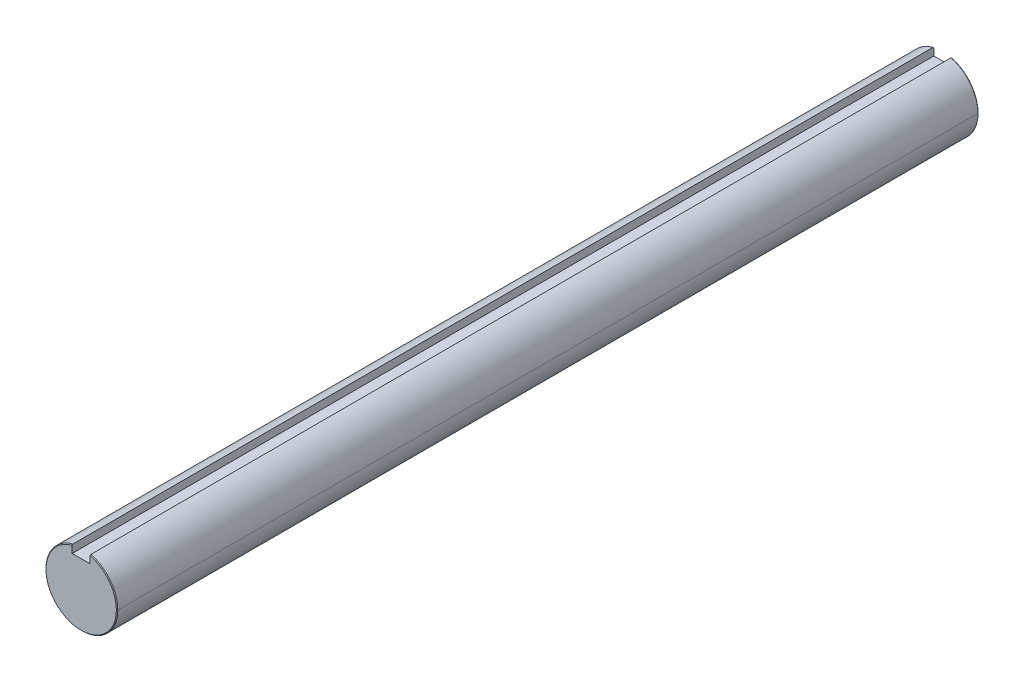
ISO-10303-21;
HEADER;
FILE_DESCRIPTION(('STEP AP214'),'2;1');
FILE_NAME('part.step','',(''),(''),'','','');
FILE_SCHEMA(('AUTOMOTIVE_DESIGN { 1 0 10303 214 1 1 1 1 }'));
ENDSEC;
DATA;
#1=APPLICATION_CONTEXT('core data for automotive mechanical design processes');
#2=APPLICATION_PROTOCOL_DEFINITION('international standard','automotive_design',2000,#1);
#3=PRODUCT_CONTEXT('',#1,'mechanical');
#4=PRODUCT('Part','Part','',(#3));
#5=PRODUCT_RELATED_PRODUCT_CATEGORY('part','',(#4));
#6=PRODUCT_DEFINITION_FORMATION('','',#4);
#7=PRODUCT_DEFINITION_CONTEXT('part definition',#1,'design');
#8=PRODUCT_DEFINITION('design','',#6,#7);
#9=PRODUCT_DEFINITION_SHAPE('','',#8);
#10=(LENGTH_UNIT() NAMED_UNIT(*) SI_UNIT(.MILLI.,.METRE.));
#11=(NAMED_UNIT(*) PLANE_ANGLE_UNIT() SI_UNIT($,.RADIAN.));
#12=(NAMED_UNIT(*) SI_UNIT($,.STERADIAN.) SOLID_ANGLE_UNIT());
#13=UNCERTAINTY_MEASURE_WITH_UNIT(LENGTH_MEASURE(1.E-05),#10,'distance_accuracy_value','');
#14=(GEOMETRIC_REPRESENTATION_CONTEXT(3) GLOBAL_UNCERTAINTY_ASSIGNED_CONTEXT((#13)) GLOBAL_UNIT_ASSIGNED_CONTEXT((#10,
#11,#12)) REPRESENTATION_CONTEXT('',''));
#15=CARTESIAN_POINT('',(0.,0.,0.));
#16=DIRECTION('',(0.,0.,1.));
#17=DIRECTION('',(1.,0.,0.));
#18=AXIS2_PLACEMENT_3D('',#15,#16,#17);
#19=CARTESIAN_POINT('',(0.,0.,114.3));
#20=DIRECTION('',(0.,0.,-1.));
#21=DIRECTION('',(-1.,0.,0.));
#22=AXIS2_PLACEMENT_3D('',#19,#20,#21);
#23=CONICAL_SURFACE('',#22,9.3345,0.785398163397448);
#24=DIRECTION('',(-0.707106781186548,0.,-0.707106781186548));
#25=VECTOR('',#24,1.);
#26=CARTESIAN_POINT('',(-9.3345,0.,114.3));
#27=LINE('',#26,#25);
#28=CARTESIAN_POINT('',(-9.3345,0.,114.3));
#29=VERTEX_POINT('',#28);
#30=CARTESIAN_POINT('',(-9.525,0.,114.1095));
#31=VERTEX_POINT('',#30);
#32=EDGE_CURVE('E177',#29,#31,#27,.T.);
#33=ORIENTED_EDGE('',*,*,#32,.F.);
#34=CARTESIAN_POINT('',(0.,0.,114.3));
#35=DIRECTION('',(0.,0.,1.));
#36=DIRECTION('',(1.,0.,0.));
#37=AXIS2_PLACEMENT_3D('',#34,#35,#36);
#38=CIRCLE('',#37,9.3345);
#39=CARTESIAN_POINT('',(-2.3876,9.02398229663603,114.3));
#40=VERTEX_POINT('',#39);
#41=EDGE_CURVE('E28',#40,#29,#38,.T.);
#42=ORIENTED_EDGE('',*,*,#41,.F.);
#43=CARTESIAN_POINT('',(-2.3876,9.22089969796873,114.1095));
#44=CARTESIAN_POINT('',(-2.3876,9.15528230054724,114.173022460899));
#45=CARTESIAN_POINT('',(-2.3876,9.08964361728234,114.236522942302));
#46=CARTESIAN_POINT('',(-2.3876,9.02398229663603,114.3));
#47=(BOUNDED_CURVE() B_SPLINE_CURVE(3,(#43,#44,#45,#46),.UNSPECIFIED.,.F.,
.F.) B_SPLINE_CURVE_WITH_KNOTS((4,4),(0.,0.00027398305229998),
.UNSPECIFIED.) CURVE() GEOMETRIC_REPRESENTATION_ITEM() RATIONAL_B_SPLINE_CURVE((1.,1.,1.,1.)) REPRESENTATION_ITEM(''));
#48=CARTESIAN_POINT('',(-2.3876,9.22089969796873,114.1095));
#49=VERTEX_POINT('',#48);
#50=EDGE_CURVE('E154',#49,#40,#47,.T.);
#51=ORIENTED_EDGE('',*,*,#50,.F.);
#52=CARTESIAN_POINT('',(0.,0.,114.1095));
#53=DIRECTION('',(0.,0.,-1.));
#54=DIRECTION('',(1.,0.,0.));
#55=AXIS2_PLACEMENT_3D('',#52,#53,#54);
#56=CIRCLE('',#55,9.525);
#57=EDGE_CURVE('E147',#31,#49,#56,.T.);
#58=ORIENTED_EDGE('',*,*,#57,.F.);
#59=EDGE_LOOP('',(#33,#42,#51,#58));
#60=FACE_BOUND('',#59,.T.);
#61=ADVANCED_FACE('F17',(#60),#23,.T.);
#62=CARTESIAN_POINT('',(0.,0.,-114.1095));
#63=DIRECTION('',(0.,0.,1.));
#64=DIRECTION('',(1.,0.,0.));
#65=AXIS2_PLACEMENT_3D('',#62,#63,#64);
#66=CONICAL_SURFACE('',#65,9.525,0.785398163397412);
#67=DIRECTION('',(0.707106781186522,0.,0.707106781186573));
#68=VECTOR('',#67,1.);
#69=CARTESIAN_POINT('',(9.525,0.,-114.1095));
#70=LINE('',#69,#68);
#71=CARTESIAN_POINT('',(9.3345,0.,-114.3));
#72=VERTEX_POINT('',#71);
#73=CARTESIAN_POINT('',(9.525,0.,-114.1095));
#74=VERTEX_POINT('',#73);
#75=EDGE_CURVE('E122',#72,#74,#70,.T.);
#76=ORIENTED_EDGE('',*,*,#75,.F.);
#77=CARTESIAN_POINT('',(0.,0.,-114.3));
#78=DIRECTION('',(0.,0.,-1.));
#79=DIRECTION('',(1.,0.,0.));
#80=AXIS2_PLACEMENT_3D('',#77,#78,#79);
#81=CIRCLE('',#80,9.3345);
#82=CARTESIAN_POINT('',(2.3876,9.023982296636,-114.3));
#83=VERTEX_POINT('',#82);
#84=EDGE_CURVE('E11',#83,#72,#81,.T.);
#85=ORIENTED_EDGE('',*,*,#84,.F.);
#86=CARTESIAN_POINT('',(2.3876,9.22089969796873,-114.1095));
#87=CARTESIAN_POINT('',(2.3876,9.15528230054722,-114.173022460899));
#88=CARTESIAN_POINT('',(2.3876,9.08964361728232,-114.236522942301));
#89=CARTESIAN_POINT('',(2.3876,9.023982296636,-114.3));
#90=(BOUNDED_CURVE() B_SPLINE_CURVE(3,(#86,#87,#88,#89),.UNSPECIFIED.,.F.,
.F.) B_SPLINE_CURVE_WITH_KNOTS((4,4),(0.,0.000273983052300029),
.UNSPECIFIED.) CURVE() GEOMETRIC_REPRESENTATION_ITEM() RATIONAL_B_SPLINE_CURVE((1.,1.,1.,1.)) REPRESENTATION_ITEM(''));
#91=CARTESIAN_POINT('',(2.3876,9.22089969796873,-114.1095));
#92=VERTEX_POINT('',#91);
#93=EDGE_CURVE('E119',#92,#83,#90,.T.);
#94=ORIENTED_EDGE('',*,*,#93,.F.);
#95=CARTESIAN_POINT('',(0.,0.,-114.1095));
#96=DIRECTION('',(0.,0.,1.));
#97=DIRECTION('',(1.,0.,0.));
#98=AXIS2_PLACEMENT_3D('',#95,#96,#97);
#99=CIRCLE('',#98,9.525);
#100=EDGE_CURVE('E207',#74,#92,#99,.T.);
#101=ORIENTED_EDGE('',*,*,#100,.F.);
#102=EDGE_LOOP('',(#76,#85,#94,#101));
#103=FACE_BOUND('',#102,.T.);
#104=ADVANCED_FACE('F117',(#103),#66,.T.);
#105=CARTESIAN_POINT('',(0.,0.,-114.3));
#106=DIRECTION('',(0.,0.,1.));
#107=DIRECTION('',(1.,0.,0.));
#108=AXIS2_PLACEMENT_3D('',#105,#106,#107);
#109=PLANE('',#108);
#110=DIRECTION('',(0.,-1.,0.));
#111=VECTOR('',#110,1.);
#112=CARTESIAN_POINT('',(2.3876,7.1374,-114.3));
#113=LINE('',#112,#111);
#114=CARTESIAN_POINT('',(2.3876,7.1374,-114.3));
#115=VERTEX_POINT('',#114);
#116=EDGE_CURVE('E126',#83,#115,#113,.T.);
#117=ORIENTED_EDGE('',*,*,#116,.F.);
#118=ORIENTED_EDGE('',*,*,#84,.T.);
#119=CARTESIAN_POINT('',(0.,0.,-114.3));
#120=DIRECTION('',(0.,0.,-1.));
#121=DIRECTION('',(1.,0.,0.));
#122=AXIS2_PLACEMENT_3D('',#119,#120,#121);
#123=CIRCLE('',#122,9.3345);
#124=CARTESIAN_POINT('',(-9.3345,0.,-114.3));
#125=VERTEX_POINT('',#124);
#126=EDGE_CURVE('E225',#72,#125,#123,.T.);
#127=ORIENTED_EDGE('',*,*,#126,.T.);
#128=CARTESIAN_POINT('',(0.,0.,-114.3));
#129=DIRECTION('',(0.,0.,-1.));
#130=DIRECTION('',(1.,0.,0.));
#131=AXIS2_PLACEMENT_3D('',#128,#129,#130);
#132=CIRCLE('',#131,9.3345);
#133=CARTESIAN_POINT('',(-2.3876,9.023982296636,-114.3));
#134=VERTEX_POINT('',#133);
#135=EDGE_CURVE('E190',#125,#134,#132,.T.);
#136=ORIENTED_EDGE('',*,*,#135,.T.);
#137=DIRECTION('',(0.,1.,0.));
#138=VECTOR('',#137,1.);
#139=CARTESIAN_POINT('',(-2.3876,7.1374,-114.3));
#140=LINE('',#139,#138);
#141=CARTESIAN_POINT('',(-2.3876,7.1374,-114.3));
#142=VERTEX_POINT('',#141);
#143=EDGE_CURVE('E162',#142,#134,#140,.T.);
#144=ORIENTED_EDGE('',*,*,#143,.F.);
#145=DIRECTION('',(-1.,0.,0.));
#146=VECTOR('',#145,1.);
#147=CARTESIAN_POINT('',(2.3876,7.1374,-114.3));
#148=LINE('',#147,#146);
#149=EDGE_CURVE('E129',#115,#142,#148,.T.);
#150=ORIENTED_EDGE('',*,*,#149,.F.);
#151=EDGE_LOOP('',(#117,#118,#127,#136,#144,#150));
#152=FACE_BOUND('',#151,.T.);
#153=ADVANCED_FACE('F127',(#152),#109,.F.);
#154=CARTESIAN_POINT('',(0.,0.,114.3));
#155=DIRECTION('',(0.,0.,1.));
#156=DIRECTION('',(1.,0.,0.));
#157=AXIS2_PLACEMENT_3D('',#154,#155,#156);
#158=PLANE('',#157);
#159=DIRECTION('',(0.,1.,0.));
#160=VECTOR('',#159,1.);
#161=CARTESIAN_POINT('',(-2.3876,7.1374,114.3));
#162=LINE('',#161,#160);
#163=CARTESIAN_POINT('',(-2.3876,7.1374,114.3));
#164=VERTEX_POINT('',#163);
#165=EDGE_CURVE('E161',#164,#40,#162,.T.);
#166=ORIENTED_EDGE('',*,*,#165,.T.);
#167=ORIENTED_EDGE('',*,*,#41,.T.);
#168=CARTESIAN_POINT('',(0.,0.,114.3));
#169=DIRECTION('',(0.,0.,1.));
#170=DIRECTION('',(1.,0.,0.));
#171=AXIS2_PLACEMENT_3D('',#168,#169,#170);
#172=CIRCLE('',#171,9.3345);
#173=CARTESIAN_POINT('',(9.3345,0.,114.3));
#174=VERTEX_POINT('',#173);
#175=EDGE_CURVE('E181',#29,#174,#172,.T.);
#176=ORIENTED_EDGE('',*,*,#175,.T.);
#177=CARTESIAN_POINT('',(0.,0.,114.3));
#178=DIRECTION('',(0.,0.,1.));
#179=DIRECTION('',(1.,0.,0.));
#180=AXIS2_PLACEMENT_3D('',#177,#178,#179);
#181=CIRCLE('',#180,9.3345);
#182=CARTESIAN_POINT('',(2.3876,9.02398229663603,114.3));
#183=VERTEX_POINT('',#182);
#184=EDGE_CURVE('E169',#174,#183,#181,.T.);
#185=ORIENTED_EDGE('',*,*,#184,.T.);
#186=DIRECTION('',(0.,-1.,0.));
#187=VECTOR('',#186,1.);
#188=CARTESIAN_POINT('',(2.3876,7.1374,114.3));
#189=LINE('',#188,#187);
#190=CARTESIAN_POINT('',(2.3876,7.1374,114.3));
#191=VERTEX_POINT('',#190);
#192=EDGE_CURVE('E247',#183,#191,#189,.T.);
#193=ORIENTED_EDGE('',*,*,#192,.T.);
#194=DIRECTION('',(-1.,0.,0.));
#195=VECTOR('',#194,1.);
#196=CARTESIAN_POINT('',(2.3876,7.1374,114.3));
#197=LINE('',#196,#195);
#198=EDGE_CURVE('E229',#191,#164,#197,.T.);
#199=ORIENTED_EDGE('',*,*,#198,.T.);
#200=EDGE_LOOP('',(#166,#167,#176,#185,#193,#199));
#201=FACE_BOUND('',#200,.T.);
#202=ADVANCED_FACE('F271',(#201),#158,.T.);
#203=CARTESIAN_POINT('',(-2.3876,7.1374,114.3));
#204=DIRECTION('',(-1.,0.,0.));
#205=DIRECTION('',(0.,0.,1.));
#206=AXIS2_PLACEMENT_3D('',#203,#204,#205);
#207=PLANE('',#206);
#208=ORIENTED_EDGE('',*,*,#143,.T.);
#209=CARTESIAN_POINT('',(-2.3876,9.023982296636,-114.3));
#210=CARTESIAN_POINT('',(-2.3876,9.08964361728232,-114.236522942301));
#211=CARTESIAN_POINT('',(-2.3876,9.15528230054722,-114.173022460899));
#212=CARTESIAN_POINT('',(-2.3876,9.22089969796873,-114.1095));
#213=(BOUNDED_CURVE() B_SPLINE_CURVE(3,(#209,#210,#211,#212),.UNSPECIFIED.,.F.,
.F.) B_SPLINE_CURVE_WITH_KNOTS((4,4),(0.,0.000273983052300029),
.UNSPECIFIED.) CURVE() GEOMETRIC_REPRESENTATION_ITEM() RATIONAL_B_SPLINE_CURVE((1.,1.,1.,1.)) REPRESENTATION_ITEM(''));
#214=CARTESIAN_POINT('',(-2.3876,9.22089969796873,-114.1095));
#215=VERTEX_POINT('',#214);
#216=EDGE_CURVE('E234',#134,#215,#213,.T.);
#217=ORIENTED_EDGE('',*,*,#216,.T.);
#218=DIRECTION('',(0.,0.,-1.));
#219=VECTOR('',#218,1.);
#220=CARTESIAN_POINT('',(-2.3876,9.22089969796873,114.3));
#221=LINE('',#220,#219);
#222=EDGE_CURVE('E140',#49,#215,#221,.T.);
#223=ORIENTED_EDGE('',*,*,#222,.F.);
#224=ORIENTED_EDGE('',*,*,#50,.T.);
#225=ORIENTED_EDGE('',*,*,#165,.F.);
#226=DIRECTION('',(0.,0.,-1.));
#227=VECTOR('',#226,1.);
#228=CARTESIAN_POINT('',(-2.3876,7.1374,114.3));
#229=LINE('',#228,#227);
#230=EDGE_CURVE('E246',#164,#142,#229,.T.);
#231=ORIENTED_EDGE('',*,*,#230,.T.);
#232=EDGE_LOOP('',(#208,#217,#223,#224,#225,#231));
#233=FACE_BOUND('',#232,.T.);
#234=ADVANCED_FACE('F274',(#233),#207,.F.);
#235=CARTESIAN_POINT('',(2.3876,7.1374,114.3));
#236=DIRECTION('',(0.,-1.,0.));
#237=DIRECTION('',(0.,0.,-1.));
#238=AXIS2_PLACEMENT_3D('',#235,#236,#237);
#239=PLANE('',#238);
#240=DIRECTION('',(0.,0.,-1.));
#241=VECTOR('',#240,1.);
#242=CARTESIAN_POINT('',(2.3876,7.1374,114.3));
#243=LINE('',#242,#241);
#244=EDGE_CURVE('E134',#191,#115,#243,.T.);
#245=ORIENTED_EDGE('',*,*,#244,.T.);
#246=ORIENTED_EDGE('',*,*,#149,.T.);
#247=ORIENTED_EDGE('',*,*,#230,.F.);
#248=ORIENTED_EDGE('',*,*,#198,.F.);
#249=EDGE_LOOP('',(#245,#246,#247,#248));
#250=FACE_BOUND('',#249,.T.);
#251=ADVANCED_FACE('F273',(#250),#239,.F.);
#252=CARTESIAN_POINT('',(2.3876,7.1374,114.3));
#253=DIRECTION('',(1.,0.,0.));
#254=DIRECTION('',(0.,1.,0.));
#255=AXIS2_PLACEMENT_3D('',#252,#253,#254);
#256=PLANE('',#255);
#257=DIRECTION('',(0.,0.,-1.));
#258=VECTOR('',#257,1.);
#259=CARTESIAN_POINT('',(2.3876,9.22089969796873,114.3));
#260=LINE('',#259,#258);
#261=CARTESIAN_POINT('',(2.3876,9.22089969796873,114.1095));
#262=VERTEX_POINT('',#261);
#263=EDGE_CURVE('E21',#262,#92,#260,.T.);
#264=ORIENTED_EDGE('',*,*,#263,.T.);
#265=ORIENTED_EDGE('',*,*,#93,.T.);
#266=ORIENTED_EDGE('',*,*,#116,.T.);
#267=ORIENTED_EDGE('',*,*,#244,.F.);
#268=ORIENTED_EDGE('',*,*,#192,.F.);
#269=CARTESIAN_POINT('',(2.3876,9.02398229663603,114.3));
#270=CARTESIAN_POINT('',(2.3876,9.08964361728234,114.236522942302));
#271=CARTESIAN_POINT('',(2.3876,9.15528230054723,114.173022460899));
#272=CARTESIAN_POINT('',(2.3876,9.22089969796873,114.1095));
#273=(BOUNDED_CURVE() B_SPLINE_CURVE(3,(#269,#270,#271,#272),.UNSPECIFIED.,.F.,
.F.) B_SPLINE_CURVE_WITH_KNOTS((4,4),(0.,0.000273983052299979),
.UNSPECIFIED.) CURVE() GEOMETRIC_REPRESENTATION_ITEM() RATIONAL_B_SPLINE_CURVE((1.,1.,1.,1.)) REPRESENTATION_ITEM(''));
#274=EDGE_CURVE('E193',#183,#262,#273,.T.);
#275=ORIENTED_EDGE('',*,*,#274,.T.);
#276=EDGE_LOOP('',(#264,#265,#266,#267,#268,#275));
#277=FACE_BOUND('',#276,.T.);
#278=ADVANCED_FACE('F136',(#277),#256,.F.);
#279=CARTESIAN_POINT('',(0.,0.,114.3));
#280=DIRECTION('',(0.,0.,-1.));
#281=DIRECTION('',(-1.,0.,0.));
#282=AXIS2_PLACEMENT_3D('',#279,#280,#281);
#283=CYLINDRICAL_SURFACE('',#282,9.525);
#284=DIRECTION('',(0.,0.,-1.));
#285=VECTOR('',#284,1.);
#286=CARTESIAN_POINT('',(-9.525,0.,114.3));
#287=LINE('',#286,#285);
#288=CARTESIAN_POINT('',(-9.525,0.,-114.1095));
#289=VERTEX_POINT('',#288);
#290=EDGE_CURVE('E258',#31,#289,#287,.T.);
#291=ORIENTED_EDGE('',*,*,#290,.F.);
#292=ORIENTED_EDGE('',*,*,#57,.T.);
#293=ORIENTED_EDGE('',*,*,#222,.T.);
#294=CARTESIAN_POINT('',(0.,0.,-114.1095));
#295=DIRECTION('',(0.,0.,1.));
#296=DIRECTION('',(1.,0.,0.));
#297=AXIS2_PLACEMENT_3D('',#294,#295,#296);
#298=CIRCLE('',#297,9.525);
#299=EDGE_CURVE('E240',#215,#289,#298,.T.);
#300=ORIENTED_EDGE('',*,*,#299,.T.);
#301=EDGE_LOOP('',(#291,#292,#293,#300));
#302=FACE_BOUND('',#301,.T.);
#303=ADVANCED_FACE('F371',(#302),#283,.T.);
#304=CARTESIAN_POINT('',(0.,0.,114.3));
#305=DIRECTION('',(0.,0.,-1.));
#306=DIRECTION('',(-1.,0.,0.));
#307=AXIS2_PLACEMENT_3D('',#304,#305,#306);
#308=CYLINDRICAL_SURFACE('',#307,9.525);
#309=DIRECTION('',(0.,0.,-1.));
#310=VECTOR('',#309,1.);
#311=CARTESIAN_POINT('',(9.525,0.,114.3));
#312=LINE('',#311,#310);
#313=CARTESIAN_POINT('',(9.525,0.,114.1095));
#314=VERTEX_POINT('',#313);
#315=EDGE_CURVE('E205',#314,#74,#312,.T.);
#316=ORIENTED_EDGE('',*,*,#315,.F.);
#317=CARTESIAN_POINT('',(0.,0.,114.1095));
#318=DIRECTION('',(0.,0.,-1.));
#319=DIRECTION('',(1.,0.,0.));
#320=AXIS2_PLACEMENT_3D('',#317,#318,#319);
#321=CIRCLE('',#320,9.525);
#322=EDGE_CURVE('E180',#314,#31,#321,.T.);
#323=ORIENTED_EDGE('',*,*,#322,.T.);
#324=ORIENTED_EDGE('',*,*,#290,.T.);
#325=CARTESIAN_POINT('',(0.,0.,-114.1095));
#326=DIRECTION('',(0.,0.,1.));
#327=DIRECTION('',(1.,0.,0.));
#328=AXIS2_PLACEMENT_3D('',#325,#326,#327);
#329=CIRCLE('',#328,9.525);
#330=EDGE_CURVE('E208',#289,#74,#329,.T.);
#331=ORIENTED_EDGE('',*,*,#330,.T.);
#332=EDGE_LOOP('',(#316,#323,#324,#331));
#333=FACE_BOUND('',#332,.T.);
#334=ADVANCED_FACE('F325',(#333),#308,.T.);
#335=CARTESIAN_POINT('',(0.,0.,114.3));
#336=DIRECTION('',(0.,0.,-1.));
#337=DIRECTION('',(-1.,0.,0.));
#338=AXIS2_PLACEMENT_3D('',#335,#336,#337);
#339=CYLINDRICAL_SURFACE('',#338,9.525);
#340=CARTESIAN_POINT('',(0.,0.,114.1095));
#341=DIRECTION('',(0.,0.,-1.));
#342=DIRECTION('',(1.,0.,0.));
#343=AXIS2_PLACEMENT_3D('',#340,#341,#342);
#344=CIRCLE('',#343,9.525);
#345=EDGE_CURVE('E176',#262,#314,#344,.T.);
#346=ORIENTED_EDGE('',*,*,#345,.T.);
#347=ORIENTED_EDGE('',*,*,#315,.T.);
#348=ORIENTED_EDGE('',*,*,#100,.T.);
#349=ORIENTED_EDGE('',*,*,#263,.F.);
#350=EDGE_LOOP('',(#346,#347,#348,#349));
#351=FACE_BOUND('',#350,.T.);
#352=ADVANCED_FACE('F320',(#351),#339,.T.);
#353=CARTESIAN_POINT('',(0.,0.,-114.1095));
#354=DIRECTION('',(0.,0.,1.));
#355=DIRECTION('',(1.,0.,0.));
#356=AXIS2_PLACEMENT_3D('',#353,#354,#355);
#357=CONICAL_SURFACE('',#356,9.525,0.785398163397412);
#358=DIRECTION('',(-0.707106781186522,0.,0.707106781186573));
#359=VECTOR('',#358,1.);
#360=CARTESIAN_POINT('',(-9.525,0.,-114.1095));
#361=LINE('',#360,#359);
#362=EDGE_CURVE('E232',#125,#289,#361,.T.);
#363=ORIENTED_EDGE('',*,*,#362,.F.);
#364=ORIENTED_EDGE('',*,*,#126,.F.);
#365=ORIENTED_EDGE('',*,*,#75,.T.);
#366=ORIENTED_EDGE('',*,*,#330,.F.);
#367=EDGE_LOOP('',(#363,#364,#365,#366));
#368=FACE_BOUND('',#367,.T.);
#369=ADVANCED_FACE('F324',(#368),#357,.T.);
#370=CARTESIAN_POINT('',(0.,0.,-114.1095));
#371=DIRECTION('',(0.,0.,1.));
#372=DIRECTION('',(1.,0.,0.));
#373=AXIS2_PLACEMENT_3D('',#370,#371,#372);
#374=CONICAL_SURFACE('',#373,9.525,0.785398163397412);
#375=ORIENTED_EDGE('',*,*,#135,.F.);
#376=ORIENTED_EDGE('',*,*,#362,.T.);
#377=ORIENTED_EDGE('',*,*,#299,.F.);
#378=ORIENTED_EDGE('',*,*,#216,.F.);
#379=EDGE_LOOP('',(#375,#376,#377,#378));
#380=FACE_BOUND('',#379,.T.);
#381=ADVANCED_FACE('F358',(#380),#374,.T.);
#382=CARTESIAN_POINT('',(0.,0.,114.3));
#383=DIRECTION('',(0.,0.,-1.));
#384=DIRECTION('',(-1.,0.,0.));
#385=AXIS2_PLACEMENT_3D('',#382,#383,#384);
#386=CONICAL_SURFACE('',#385,9.3345,0.785398163397448);
#387=DIRECTION('',(0.707106781186548,0.,-0.707106781186548));
#388=VECTOR('',#387,1.);
#389=CARTESIAN_POINT('',(9.3345,0.,114.3));
#390=LINE('',#389,#388);
#391=EDGE_CURVE('E173',#174,#314,#390,.T.);
#392=ORIENTED_EDGE('',*,*,#391,.F.);
#393=ORIENTED_EDGE('',*,*,#175,.F.);
#394=ORIENTED_EDGE('',*,*,#32,.T.);
#395=ORIENTED_EDGE('',*,*,#322,.F.);
#396=EDGE_LOOP('',(#392,#393,#394,#395));
#397=FACE_BOUND('',#396,.T.);
#398=ADVANCED_FACE('F362',(#397),#386,.T.);
#399=CARTESIAN_POINT('',(0.,0.,114.3));
#400=DIRECTION('',(0.,0.,-1.));
#401=DIRECTION('',(-1.,0.,0.));
#402=AXIS2_PLACEMENT_3D('',#399,#400,#401);
#403=CONICAL_SURFACE('',#402,9.3345,0.785398163397448);
#404=ORIENTED_EDGE('',*,*,#184,.F.);
#405=ORIENTED_EDGE('',*,*,#391,.T.);
#406=ORIENTED_EDGE('',*,*,#345,.F.);
#407=ORIENTED_EDGE('',*,*,#274,.F.);
#408=EDGE_LOOP('',(#404,#405,#406,#407));
#409=FACE_BOUND('',#408,.T.);
#410=ADVANCED_FACE('F19',(#409),#403,.T.);
#411=CLOSED_SHELL('',(#61,#104,#153,#202,#234,#251,#278,#303,#334,#352,#369,#381,#398,#410));
#412=MANIFOLD_SOLID_BREP('B1',#411);
#413=ADVANCED_BREP_SHAPE_REPRESENTATION('',(#18,#412),#14);
#414=SHAPE_DEFINITION_REPRESENTATION(#9,#413);
ENDSEC;
END-ISO-10303-21;
